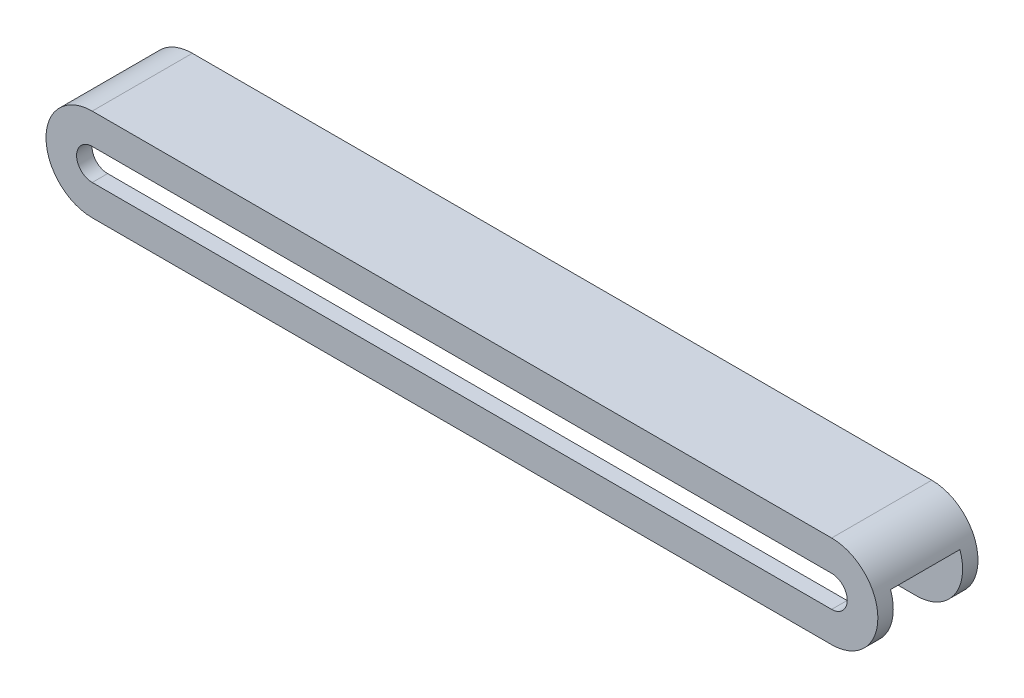
ISO-10303-21;
HEADER;
FILE_DESCRIPTION(('STEP AP214'),'2;1');
FILE_NAME('part.step','',(''),(''),'','','');
FILE_SCHEMA(('AUTOMOTIVE_DESIGN { 1 0 10303 214 1 1 1 1 }'));
ENDSEC;
DATA;
#1=APPLICATION_CONTEXT('core data for automotive mechanical design processes');
#2=APPLICATION_PROTOCOL_DEFINITION('international standard','automotive_design',2000,#1);
#3=PRODUCT_CONTEXT('',#1,'mechanical');
#4=PRODUCT('Part','Part','',(#3));
#5=PRODUCT_RELATED_PRODUCT_CATEGORY('part','',(#4));
#6=PRODUCT_DEFINITION_FORMATION('','',#4);
#7=PRODUCT_DEFINITION_CONTEXT('part definition',#1,'design');
#8=PRODUCT_DEFINITION('design','',#6,#7);
#9=PRODUCT_DEFINITION_SHAPE('','',#8);
#10=(LENGTH_UNIT() NAMED_UNIT(*) SI_UNIT(.MILLI.,.METRE.));
#11=(NAMED_UNIT(*) PLANE_ANGLE_UNIT() SI_UNIT($,.RADIAN.));
#12=(NAMED_UNIT(*) SI_UNIT($,.STERADIAN.) SOLID_ANGLE_UNIT());
#13=UNCERTAINTY_MEASURE_WITH_UNIT(LENGTH_MEASURE(1.E-05),#10,'distance_accuracy_value','');
#14=(GEOMETRIC_REPRESENTATION_CONTEXT(3) GLOBAL_UNCERTAINTY_ASSIGNED_CONTEXT((#13)) GLOBAL_UNIT_ASSIGNED_CONTEXT((#10,
#11,#12)) REPRESENTATION_CONTEXT('',''));
#15=CARTESIAN_POINT('',(0.,0.,0.));
#16=DIRECTION('',(0.,0.,1.));
#17=DIRECTION('',(1.,0.,0.));
#18=AXIS2_PLACEMENT_3D('',#15,#16,#17);
#19=CARTESIAN_POINT('',(0.,-19.05,41.275));
#20=DIRECTION('',(0.,1.,0.));
#21=DIRECTION('',(0.,0.,1.));
#22=AXIS2_PLACEMENT_3D('',#19,#20,#21);
#23=PLANE('',#22);
#24=DIRECTION('',(0.,0.,-1.));
#25=VECTOR('',#24,1.);
#26=CARTESIAN_POINT('',(304.8,-19.05,41.275));
#27=LINE('',#26,#25);
#28=CARTESIAN_POINT('',(304.8,-19.05,6.35));
#29=VERTEX_POINT('',#28);
#30=CARTESIAN_POINT('',(304.8,-19.05,0.));
#31=VERTEX_POINT('',#30);
#32=EDGE_CURVE('E234',#29,#31,#27,.T.);
#33=ORIENTED_EDGE('',*,*,#32,.F.);
#34=DIRECTION('',(1.,0.,0.));
#35=VECTOR('',#34,1.);
#36=CARTESIAN_POINT('',(323.85,-19.05,6.35));
#37=LINE('',#36,#35);
#38=CARTESIAN_POINT('',(0.,-19.05,6.35));
#39=VERTEX_POINT('',#38);
#40=EDGE_CURVE('E265',#39,#29,#37,.T.);
#41=ORIENTED_EDGE('',*,*,#40,.F.);
#42=DIRECTION('',(0.,0.,-1.));
#43=VECTOR('',#42,1.);
#44=CARTESIAN_POINT('',(0.,-19.05,41.275));
#45=LINE('',#44,#43);
#46=CARTESIAN_POINT('',(0.,-19.05,0.));
#47=VERTEX_POINT('',#46);
#48=EDGE_CURVE('E41',#39,#47,#45,.T.);
#49=ORIENTED_EDGE('',*,*,#48,.T.);
#50=DIRECTION('',(1.,0.,0.));
#51=VECTOR('',#50,1.);
#52=CARTESIAN_POINT('',(0.,-19.05,0.));
#53=LINE('',#52,#51);
#54=EDGE_CURVE('E224',#47,#31,#53,.T.);
#55=ORIENTED_EDGE('',*,*,#54,.T.);
#56=EDGE_LOOP('',(#33,#41,#49,#55));
#57=FACE_BOUND('',#56,.T.);
#58=ADVANCED_FACE('F33',(#57),#23,.F.);
#59=CARTESIAN_POINT('',(304.8,0.,41.275));
#60=DIRECTION('',(0.,0.,-1.));
#61=DIRECTION('',(-1.,0.,0.));
#62=AXIS2_PLACEMENT_3D('',#59,#60,#61);
#63=CYLINDRICAL_SURFACE('',#62,19.05);
#64=CARTESIAN_POINT('',(304.8,0.,6.35));
#65=DIRECTION('',(0.,0.,-1.));
#66=DIRECTION('',(-1.,0.,0.));
#67=AXIS2_PLACEMENT_3D('',#64,#65,#66);
#68=CIRCLE('',#67,19.05);
#69=CARTESIAN_POINT('',(322.731112639697,6.43255,6.35));
#70=VERTEX_POINT('',#69);
#71=EDGE_CURVE('E245',#70,#29,#68,.T.);
#72=ORIENTED_EDGE('',*,*,#71,.T.);
#73=ORIENTED_EDGE('',*,*,#32,.T.);
#74=CARTESIAN_POINT('',(304.8,0.,0.));
#75=DIRECTION('',(0.,0.,1.));
#76=DIRECTION('',(1.,0.,0.));
#77=AXIS2_PLACEMENT_3D('',#74,#75,#76);
#78=CIRCLE('',#77,19.05);
#79=CARTESIAN_POINT('',(304.8,19.05,0.));
#80=VERTEX_POINT('',#79);
#81=EDGE_CURVE('E227',#31,#80,#78,.T.);
#82=ORIENTED_EDGE('',*,*,#81,.T.);
#83=DIRECTION('',(0.,0.,-1.));
#84=VECTOR('',#83,1.);
#85=CARTESIAN_POINT('',(304.8,19.05,41.275));
#86=LINE('',#85,#84);
#87=CARTESIAN_POINT('',(304.8,19.05,41.275));
#88=VERTEX_POINT('',#87);
#89=EDGE_CURVE('E232',#88,#80,#86,.T.);
#90=ORIENTED_EDGE('',*,*,#89,.F.);
#91=CARTESIAN_POINT('',(304.8,0.,41.275));
#92=DIRECTION('',(0.,0.,1.));
#93=DIRECTION('',(1.,0.,0.));
#94=AXIS2_PLACEMENT_3D('',#91,#92,#93);
#95=CIRCLE('',#94,19.05);
#96=CARTESIAN_POINT('',(304.8,-19.05,41.275));
#97=VERTEX_POINT('',#96);
#98=EDGE_CURVE('E217',#97,#88,#95,.T.);
#99=ORIENTED_EDGE('',*,*,#98,.F.);
#100=CARTESIAN_POINT('',(304.8,-19.05,34.925));
#101=VERTEX_POINT('',#100);
#102=EDGE_CURVE('E235',#97,#101,#27,.T.);
#103=ORIENTED_EDGE('',*,*,#102,.T.);
#104=CARTESIAN_POINT('',(304.8,0.,34.925));
#105=DIRECTION('',(0.,0.,1.));
#106=DIRECTION('',(1.,0.,0.));
#107=AXIS2_PLACEMENT_3D('',#104,#105,#106);
#108=CIRCLE('',#107,19.05);
#109=CARTESIAN_POINT('',(322.731112639697,6.43254999999998,34.925));
#110=VERTEX_POINT('',#109);
#111=EDGE_CURVE('E156',#101,#110,#108,.T.);
#112=ORIENTED_EDGE('',*,*,#111,.T.);
#113=DIRECTION('',(0.,0.,-1.));
#114=VECTOR('',#113,1.);
#115=CARTESIAN_POINT('',(322.731112639697,6.43255,41.275));
#116=LINE('',#115,#114);
#117=EDGE_CURVE('E171',#70,#110,#116,.F.);
#118=ORIENTED_EDGE('',*,*,#117,.F.);
#119=EDGE_LOOP('',(#72,#73,#82,#90,#99,#103,#112,#118));
#120=FACE_BOUND('',#119,.T.);
#121=ADVANCED_FACE('F241',(#120),#63,.T.);
#122=CARTESIAN_POINT('',(0.,0.,41.275));
#123=DIRECTION('',(0.,0.,-1.));
#124=DIRECTION('',(-1.,0.,0.));
#125=AXIS2_PLACEMENT_3D('',#122,#123,#124);
#126=CYLINDRICAL_SURFACE('',#125,6.43255);
#127=CARTESIAN_POINT('',(0.,0.,6.35));
#128=DIRECTION('',(0.,0.,-1.));
#129=DIRECTION('',(-1.,0.,0.));
#130=AXIS2_PLACEMENT_3D('',#127,#128,#129);
#131=CIRCLE('',#130,6.43255);
#132=CARTESIAN_POINT('',(0.,-6.43255,6.35));
#133=VERTEX_POINT('',#132);
#134=CARTESIAN_POINT('',(0.,6.43254999999998,6.35));
#135=VERTEX_POINT('',#134);
#136=EDGE_CURVE('E280',#133,#135,#131,.T.);
#137=ORIENTED_EDGE('',*,*,#136,.F.);
#138=DIRECTION('',(0.,0.,-1.));
#139=VECTOR('',#138,1.);
#140=CARTESIAN_POINT('',(0.,-6.43255,41.275));
#141=LINE('',#140,#139);
#142=CARTESIAN_POINT('',(0.,-6.43255,0.));
#143=VERTEX_POINT('',#142);
#144=EDGE_CURVE('E206',#133,#143,#141,.T.);
#145=ORIENTED_EDGE('',*,*,#144,.T.);
#146=CARTESIAN_POINT('',(0.,0.,0.));
#147=DIRECTION('',(0.,0.,1.));
#148=DIRECTION('',(1.,0.,0.));
#149=AXIS2_PLACEMENT_3D('',#146,#147,#148);
#150=CIRCLE('',#149,6.43255);
#151=CARTESIAN_POINT('',(0.,6.43255,0.));
#152=VERTEX_POINT('',#151);
#153=EDGE_CURVE('E170',#152,#143,#150,.T.);
#154=ORIENTED_EDGE('',*,*,#153,.F.);
#155=DIRECTION('',(0.,0.,-1.));
#156=VECTOR('',#155,1.);
#157=CARTESIAN_POINT('',(0.,6.43255,41.275));
#158=LINE('',#157,#156);
#159=EDGE_CURVE('E188',#135,#152,#158,.T.);
#160=ORIENTED_EDGE('',*,*,#159,.F.);
#161=EDGE_LOOP('',(#137,#145,#154,#160));
#162=FACE_BOUND('',#161,.T.);
#163=ADVANCED_FACE('F291',(#162),#126,.F.);
#164=CARTESIAN_POINT('',(0.,-6.43255,41.275));
#165=DIRECTION('',(0.,1.,0.));
#166=DIRECTION('',(0.,0.,1.));
#167=AXIS2_PLACEMENT_3D('',#164,#165,#166);
#168=PLANE('',#167);
#169=DIRECTION('',(-1.,0.,0.));
#170=VECTOR('',#169,1.);
#171=CARTESIAN_POINT('',(0.,-6.43255,6.35));
#172=LINE('',#171,#170);
#173=CARTESIAN_POINT('',(304.8,-6.43255,6.35));
#174=VERTEX_POINT('',#173);
#175=EDGE_CURVE('E278',#174,#133,#172,.T.);
#176=ORIENTED_EDGE('',*,*,#175,.F.);
#177=DIRECTION('',(0.,0.,-1.));
#178=VECTOR('',#177,1.);
#179=CARTESIAN_POINT('',(304.8,-6.43255,41.275));
#180=LINE('',#179,#178);
#181=CARTESIAN_POINT('',(304.8,-6.43255,0.));
#182=VERTEX_POINT('',#181);
#183=EDGE_CURVE('E202',#174,#182,#180,.T.);
#184=ORIENTED_EDGE('',*,*,#183,.T.);
#185=DIRECTION('',(1.,0.,0.));
#186=VECTOR('',#185,1.);
#187=CARTESIAN_POINT('',(0.,-6.43255,0.));
#188=LINE('',#187,#186);
#189=EDGE_CURVE('E174',#143,#182,#188,.T.);
#190=ORIENTED_EDGE('',*,*,#189,.F.);
#191=ORIENTED_EDGE('',*,*,#144,.F.);
#192=EDGE_LOOP('',(#176,#184,#190,#191));
#193=FACE_BOUND('',#192,.T.);
#194=ADVANCED_FACE('F299',(#193),#168,.T.);
#195=CARTESIAN_POINT('',(304.8,0.,41.275));
#196=DIRECTION('',(0.,0.,-1.));
#197=DIRECTION('',(-1.,0.,0.));
#198=AXIS2_PLACEMENT_3D('',#195,#196,#197);
#199=CYLINDRICAL_SURFACE('',#198,6.43255);
#200=CARTESIAN_POINT('',(304.8,0.,6.35));
#201=DIRECTION('',(0.,0.,-1.));
#202=DIRECTION('',(-1.,0.,0.));
#203=AXIS2_PLACEMENT_3D('',#200,#201,#202);
#204=CIRCLE('',#203,6.43255);
#205=CARTESIAN_POINT('',(304.8,6.43254999999998,6.35));
#206=VERTEX_POINT('',#205);
#207=EDGE_CURVE('E155',#206,#174,#204,.T.);
#208=ORIENTED_EDGE('',*,*,#207,.F.);
#209=DIRECTION('',(0.,0.,-1.));
#210=VECTOR('',#209,1.);
#211=CARTESIAN_POINT('',(304.8,6.43255,41.275));
#212=LINE('',#211,#210);
#213=CARTESIAN_POINT('',(304.8,6.43255,0.));
#214=VERTEX_POINT('',#213);
#215=EDGE_CURVE('E198',#206,#214,#212,.T.);
#216=ORIENTED_EDGE('',*,*,#215,.T.);
#217=CARTESIAN_POINT('',(304.8,0.,0.));
#218=DIRECTION('',(0.,0.,1.));
#219=DIRECTION('',(1.,0.,0.));
#220=AXIS2_PLACEMENT_3D('',#217,#218,#219);
#221=CIRCLE('',#220,6.43255);
#222=EDGE_CURVE('E192',#182,#214,#221,.T.);
#223=ORIENTED_EDGE('',*,*,#222,.F.);
#224=ORIENTED_EDGE('',*,*,#183,.F.);
#225=EDGE_LOOP('',(#208,#216,#223,#224));
#226=FACE_BOUND('',#225,.T.);
#227=ADVANCED_FACE('F296',(#226),#199,.F.);
#228=CARTESIAN_POINT('',(0.,0.,41.275));
#229=DIRECTION('',(0.,0.,1.));
#230=DIRECTION('',(1.,0.,0.));
#231=AXIS2_PLACEMENT_3D('',#228,#229,#230);
#232=PLANE('',#231);
#233=CARTESIAN_POINT('',(0.,0.,41.275));
#234=DIRECTION('',(0.,0.,1.));
#235=DIRECTION('',(1.,0.,0.));
#236=AXIS2_PLACEMENT_3D('',#233,#234,#235);
#237=CIRCLE('',#236,19.05);
#238=CARTESIAN_POINT('',(0.,19.05,41.275));
#239=VERTEX_POINT('',#238);
#240=CARTESIAN_POINT('',(0.,-19.05,41.275));
#241=VERTEX_POINT('',#240);
#242=EDGE_CURVE('E211',#239,#241,#237,.T.);
#243=ORIENTED_EDGE('',*,*,#242,.T.);
#244=DIRECTION('',(1.,0.,0.));
#245=VECTOR('',#244,1.);
#246=CARTESIAN_POINT('',(0.,-19.05,41.275));
#247=LINE('',#246,#245);
#248=EDGE_CURVE('E214',#241,#97,#247,.T.);
#249=ORIENTED_EDGE('',*,*,#248,.T.);
#250=ORIENTED_EDGE('',*,*,#98,.T.);
#251=DIRECTION('',(-1.,0.,0.));
#252=VECTOR('',#251,1.);
#253=CARTESIAN_POINT('',(0.,19.05,41.275));
#254=LINE('',#253,#252);
#255=EDGE_CURVE('E219',#88,#239,#254,.T.);
#256=ORIENTED_EDGE('',*,*,#255,.T.);
#257=EDGE_LOOP('',(#243,#249,#250,#256));
#258=FACE_BOUND('',#257,.T.);
#259=DIRECTION('',(1.,0.,0.));
#260=VECTOR('',#259,1.);
#261=CARTESIAN_POINT('',(0.,-6.43255,41.275));
#262=LINE('',#261,#260);
#263=CARTESIAN_POINT('',(0.,-6.43255,41.275));
#264=VERTEX_POINT('',#263);
#265=CARTESIAN_POINT('',(304.8,-6.43255,41.275));
#266=VERTEX_POINT('',#265);
#267=EDGE_CURVE('E181',#264,#266,#262,.T.);
#268=ORIENTED_EDGE('',*,*,#267,.F.);
#269=CARTESIAN_POINT('',(0.,0.,41.275));
#270=DIRECTION('',(0.,0.,1.));
#271=DIRECTION('',(1.,0.,0.));
#272=AXIS2_PLACEMENT_3D('',#269,#270,#271);
#273=CIRCLE('',#272,6.43255);
#274=CARTESIAN_POINT('',(0.,6.43255,41.275));
#275=VERTEX_POINT('',#274);
#276=EDGE_CURVE('E179',#275,#264,#273,.T.);
#277=ORIENTED_EDGE('',*,*,#276,.F.);
#278=DIRECTION('',(-1.,0.,0.));
#279=VECTOR('',#278,1.);
#280=CARTESIAN_POINT('',(0.,6.43255,41.275));
#281=LINE('',#280,#279);
#282=CARTESIAN_POINT('',(304.8,6.43255,41.275));
#283=VERTEX_POINT('',#282);
#284=EDGE_CURVE('E187',#283,#275,#281,.T.);
#285=ORIENTED_EDGE('',*,*,#284,.F.);
#286=CARTESIAN_POINT('',(304.8,0.,41.275));
#287=DIRECTION('',(0.,0.,1.));
#288=DIRECTION('',(1.,0.,0.));
#289=AXIS2_PLACEMENT_3D('',#286,#287,#288);
#290=CIRCLE('',#289,6.43255);
#291=EDGE_CURVE('E184',#266,#283,#290,.T.);
#292=ORIENTED_EDGE('',*,*,#291,.F.);
#293=EDGE_LOOP('',(#268,#277,#285,#292));
#294=FACE_BOUND('',#293,.T.);
#295=ADVANCED_FACE('F261',(#258,#294),#232,.T.);
#296=CARTESIAN_POINT('',(0.,0.,0.));
#297=DIRECTION('',(0.,0.,1.));
#298=DIRECTION('',(1.,0.,0.));
#299=AXIS2_PLACEMENT_3D('',#296,#297,#298);
#300=PLANE('',#299);
#301=CARTESIAN_POINT('',(0.,0.,0.));
#302=DIRECTION('',(0.,0.,1.));
#303=DIRECTION('',(1.,0.,0.));
#304=AXIS2_PLACEMENT_3D('',#301,#302,#303);
#305=CIRCLE('',#304,19.05);
#306=CARTESIAN_POINT('',(0.,19.05,0.));
#307=VERTEX_POINT('',#306);
#308=EDGE_CURVE('E210',#307,#47,#305,.T.);
#309=ORIENTED_EDGE('',*,*,#308,.F.);
#310=DIRECTION('',(-1.,0.,0.));
#311=VECTOR('',#310,1.);
#312=CARTESIAN_POINT('',(0.,19.05,0.));
#313=LINE('',#312,#311);
#314=EDGE_CURVE('E215',#80,#307,#313,.T.);
#315=ORIENTED_EDGE('',*,*,#314,.F.);
#316=ORIENTED_EDGE('',*,*,#81,.F.);
#317=ORIENTED_EDGE('',*,*,#54,.F.);
#318=EDGE_LOOP('',(#309,#315,#316,#317));
#319=FACE_BOUND('',#318,.T.);
#320=ORIENTED_EDGE('',*,*,#153,.T.);
#321=ORIENTED_EDGE('',*,*,#189,.T.);
#322=ORIENTED_EDGE('',*,*,#222,.T.);
#323=DIRECTION('',(-1.,0.,0.));
#324=VECTOR('',#323,1.);
#325=CARTESIAN_POINT('',(0.,6.43255,0.));
#326=LINE('',#325,#324);
#327=EDGE_CURVE('E182',#214,#152,#326,.T.);
#328=ORIENTED_EDGE('',*,*,#327,.T.);
#329=EDGE_LOOP('',(#320,#321,#322,#328));
#330=FACE_BOUND('',#329,.T.);
#331=ADVANCED_FACE('F253',(#319,#330),#300,.F.);
#332=CARTESIAN_POINT('',(0.,0.,41.275));
#333=DIRECTION('',(0.,0.,-1.));
#334=DIRECTION('',(-1.,0.,0.));
#335=AXIS2_PLACEMENT_3D('',#332,#333,#334);
#336=CYLINDRICAL_SURFACE('',#335,19.05);
#337=CARTESIAN_POINT('',(0.,0.,34.925));
#338=DIRECTION('',(0.,0.,1.));
#339=DIRECTION('',(1.,0.,0.));
#340=AXIS2_PLACEMENT_3D('',#337,#338,#339);
#341=CIRCLE('',#340,19.05);
#342=CARTESIAN_POINT('',(-17.9311126396969,6.43254999999998,34.925));
#343=VERTEX_POINT('',#342);
#344=CARTESIAN_POINT('',(0.,-19.05,34.925));
#345=VERTEX_POINT('',#344);
#346=EDGE_CURVE('E145',#343,#345,#341,.T.);
#347=ORIENTED_EDGE('',*,*,#346,.T.);
#348=EDGE_CURVE('E11',#241,#345,#45,.T.);
#349=ORIENTED_EDGE('',*,*,#348,.F.);
#350=ORIENTED_EDGE('',*,*,#242,.F.);
#351=DIRECTION('',(0.,0.,-1.));
#352=VECTOR('',#351,1.);
#353=CARTESIAN_POINT('',(0.,19.05,41.275));
#354=LINE('',#353,#352);
#355=EDGE_CURVE('E221',#239,#307,#354,.T.);
#356=ORIENTED_EDGE('',*,*,#355,.T.);
#357=ORIENTED_EDGE('',*,*,#308,.T.);
#358=ORIENTED_EDGE('',*,*,#48,.F.);
#359=CARTESIAN_POINT('',(0.,0.,6.35));
#360=DIRECTION('',(0.,0.,-1.));
#361=DIRECTION('',(-1.,0.,0.));
#362=AXIS2_PLACEMENT_3D('',#359,#360,#361);
#363=CIRCLE('',#362,19.05);
#364=CARTESIAN_POINT('',(-17.9311126396969,6.43254999999998,6.35));
#365=VERTEX_POINT('',#364);
#366=EDGE_CURVE('E169',#39,#365,#363,.T.);
#367=ORIENTED_EDGE('',*,*,#366,.T.);
#368=DIRECTION('',(0.,0.,-1.));
#369=VECTOR('',#368,1.);
#370=CARTESIAN_POINT('',(-17.931112639697,6.43255,41.275));
#371=LINE('',#370,#369);
#372=EDGE_CURVE('E162',#343,#365,#371,.T.);
#373=ORIENTED_EDGE('',*,*,#372,.F.);
#374=EDGE_LOOP('',(#347,#349,#350,#356,#357,#358,#367,#373));
#375=FACE_BOUND('',#374,.T.);
#376=ADVANCED_FACE('F35',(#375),#336,.T.);
#377=ORIENTED_EDGE('',*,*,#348,.T.);
#378=DIRECTION('',(-1.,0.,0.));
#379=VECTOR('',#378,1.);
#380=CARTESIAN_POINT('',(323.85,-19.05,34.925));
#381=LINE('',#380,#379);
#382=EDGE_CURVE('E151',#101,#345,#381,.T.);
#383=ORIENTED_EDGE('',*,*,#382,.F.);
#384=ORIENTED_EDGE('',*,*,#102,.F.);
#385=ORIENTED_EDGE('',*,*,#248,.F.);
#386=EDGE_LOOP('',(#377,#383,#384,#385));
#387=FACE_BOUND('',#386,.T.);
#388=ADVANCED_FACE('F264',(#387),#23,.F.);
#389=CARTESIAN_POINT('',(0.,19.05,41.275));
#390=DIRECTION('',(0.,-1.,0.));
#391=DIRECTION('',(0.,0.,-1.));
#392=AXIS2_PLACEMENT_3D('',#389,#390,#391);
#393=PLANE('',#392);
#394=ORIENTED_EDGE('',*,*,#314,.T.);
#395=ORIENTED_EDGE('',*,*,#355,.F.);
#396=ORIENTED_EDGE('',*,*,#255,.F.);
#397=ORIENTED_EDGE('',*,*,#89,.T.);
#398=EDGE_LOOP('',(#394,#395,#396,#397));
#399=FACE_BOUND('',#398,.T.);
#400=ADVANCED_FACE('F257',(#399),#393,.F.);
#401=CARTESIAN_POINT('',(0.,0.,34.925));
#402=DIRECTION('',(0.,0.,1.));
#403=DIRECTION('',(1.,0.,0.));
#404=AXIS2_PLACEMENT_3D('',#401,#402,#403);
#405=CIRCLE('',#404,6.43255);
#406=CARTESIAN_POINT('',(0.,6.43254999999998,34.925));
#407=VERTEX_POINT('',#406);
#408=CARTESIAN_POINT('',(0.,-6.43255,34.925));
#409=VERTEX_POINT('',#408);
#410=EDGE_CURVE('E274',#407,#409,#405,.T.);
#411=ORIENTED_EDGE('',*,*,#410,.F.);
#412=EDGE_CURVE('E165',#275,#407,#158,.T.);
#413=ORIENTED_EDGE('',*,*,#412,.F.);
#414=ORIENTED_EDGE('',*,*,#276,.T.);
#415=EDGE_CURVE('E207',#264,#409,#141,.T.);
#416=ORIENTED_EDGE('',*,*,#415,.T.);
#417=EDGE_LOOP('',(#411,#413,#414,#416));
#418=FACE_BOUND('',#417,.T.);
#419=ADVANCED_FACE('F310',(#418),#126,.F.);
#420=DIRECTION('',(1.,0.,0.));
#421=VECTOR('',#420,1.);
#422=CARTESIAN_POINT('',(0.,-6.43255,34.925));
#423=LINE('',#422,#421);
#424=CARTESIAN_POINT('',(304.8,-6.43255,34.925));
#425=VERTEX_POINT('',#424);
#426=EDGE_CURVE('E272',#409,#425,#423,.T.);
#427=ORIENTED_EDGE('',*,*,#426,.F.);
#428=ORIENTED_EDGE('',*,*,#415,.F.);
#429=ORIENTED_EDGE('',*,*,#267,.T.);
#430=EDGE_CURVE('E203',#266,#425,#180,.T.);
#431=ORIENTED_EDGE('',*,*,#430,.T.);
#432=EDGE_LOOP('',(#427,#428,#429,#431));
#433=FACE_BOUND('',#432,.T.);
#434=ADVANCED_FACE('F302',(#433),#168,.T.);
#435=CARTESIAN_POINT('',(304.8,0.,34.925));
#436=DIRECTION('',(0.,0.,1.));
#437=DIRECTION('',(1.,0.,0.));
#438=AXIS2_PLACEMENT_3D('',#435,#436,#437);
#439=CIRCLE('',#438,6.43255);
#440=CARTESIAN_POINT('',(304.8,6.43255,34.925));
#441=VERTEX_POINT('',#440);
#442=EDGE_CURVE('E166',#425,#441,#439,.T.);
#443=ORIENTED_EDGE('',*,*,#442,.F.);
#444=ORIENTED_EDGE('',*,*,#430,.F.);
#445=ORIENTED_EDGE('',*,*,#291,.T.);
#446=EDGE_CURVE('E199',#283,#441,#212,.T.);
#447=ORIENTED_EDGE('',*,*,#446,.T.);
#448=EDGE_LOOP('',(#443,#444,#445,#447));
#449=FACE_BOUND('',#448,.T.);
#450=ADVANCED_FACE('F308',(#449),#199,.F.);
#451=CARTESIAN_POINT('',(0.,6.43255,41.275));
#452=DIRECTION('',(0.,-1.,0.));
#453=DIRECTION('',(0.,0.,-1.));
#454=AXIS2_PLACEMENT_3D('',#451,#452,#453);
#455=PLANE('',#454);
#456=ORIENTED_EDGE('',*,*,#412,.T.);
#457=DIRECTION('',(1.,0.,0.));
#458=VECTOR('',#457,1.);
#459=CARTESIAN_POINT('',(323.85,6.43254999999998,34.925));
#460=LINE('',#459,#458);
#461=EDGE_CURVE('E148',#343,#407,#460,.T.);
#462=ORIENTED_EDGE('',*,*,#461,.F.);
#463=ORIENTED_EDGE('',*,*,#372,.T.);
#464=DIRECTION('',(-1.,0.,0.));
#465=VECTOR('',#464,1.);
#466=CARTESIAN_POINT('',(323.85,6.43254999999998,6.35));
#467=LINE('',#466,#465);
#468=EDGE_CURVE('E267',#135,#365,#467,.T.);
#469=ORIENTED_EDGE('',*,*,#468,.F.);
#470=ORIENTED_EDGE('',*,*,#159,.T.);
#471=ORIENTED_EDGE('',*,*,#327,.F.);
#472=ORIENTED_EDGE('',*,*,#215,.F.);
#473=EDGE_CURVE('E48',#70,#206,#467,.T.);
#474=ORIENTED_EDGE('',*,*,#473,.F.);
#475=ORIENTED_EDGE('',*,*,#117,.T.);
#476=EDGE_CURVE('E54',#441,#110,#460,.T.);
#477=ORIENTED_EDGE('',*,*,#476,.F.);
#478=ORIENTED_EDGE('',*,*,#446,.F.);
#479=ORIENTED_EDGE('',*,*,#284,.T.);
#480=EDGE_LOOP('',(#456,#462,#463,#469,#470,#471,#472,#474,#475,#477,#478,#479));
#481=FACE_BOUND('',#480,.T.);
#482=ADVANCED_FACE('F160',(#481),#455,.T.);
#483=CARTESIAN_POINT('',(323.85,350.52111508899,6.35));
#484=DIRECTION('',(0.,0.,-1.));
#485=DIRECTION('',(-1.,0.,0.));
#486=AXIS2_PLACEMENT_3D('',#483,#484,#485);
#487=PLANE('',#486);
#488=ORIENTED_EDGE('',*,*,#366,.F.);
#489=ORIENTED_EDGE('',*,*,#40,.T.);
#490=ORIENTED_EDGE('',*,*,#71,.F.);
#491=ORIENTED_EDGE('',*,*,#473,.T.);
#492=ORIENTED_EDGE('',*,*,#207,.T.);
#493=ORIENTED_EDGE('',*,*,#175,.T.);
#494=ORIENTED_EDGE('',*,*,#136,.T.);
#495=ORIENTED_EDGE('',*,*,#468,.T.);
#496=EDGE_LOOP('',(#488,#489,#490,#491,#492,#493,#494,#495));
#497=FACE_BOUND('',#496,.T.);
#498=ADVANCED_FACE('F284',(#497),#487,.F.);
#499=CARTESIAN_POINT('',(323.85,350.52111508899,34.925));
#500=DIRECTION('',(0.,0.,1.));
#501=DIRECTION('',(1.,0.,0.));
#502=AXIS2_PLACEMENT_3D('',#499,#500,#501);
#503=PLANE('',#502);
#504=ORIENTED_EDGE('',*,*,#461,.T.);
#505=ORIENTED_EDGE('',*,*,#410,.T.);
#506=ORIENTED_EDGE('',*,*,#426,.T.);
#507=ORIENTED_EDGE('',*,*,#442,.T.);
#508=ORIENTED_EDGE('',*,*,#476,.T.);
#509=ORIENTED_EDGE('',*,*,#111,.F.);
#510=ORIENTED_EDGE('',*,*,#382,.T.);
#511=ORIENTED_EDGE('',*,*,#346,.F.);
#512=EDGE_LOOP('',(#504,#505,#506,#507,#508,#509,#510,#511));
#513=FACE_BOUND('',#512,.T.);
#514=ADVANCED_FACE('F147',(#513),#503,.F.);
#515=CLOSED_SHELL('',(#58,#121,#163,#194,#227,#295,#331,#376,#388,#400,#419,#434,#450,#482,#498,#514));
#516=MANIFOLD_SOLID_BREP('B2',#515);
#517=ADVANCED_BREP_SHAPE_REPRESENTATION('',(#18,#516),#14);
#518=SHAPE_DEFINITION_REPRESENTATION(#9,#517);
ENDSEC;
END-ISO-10303-21;
